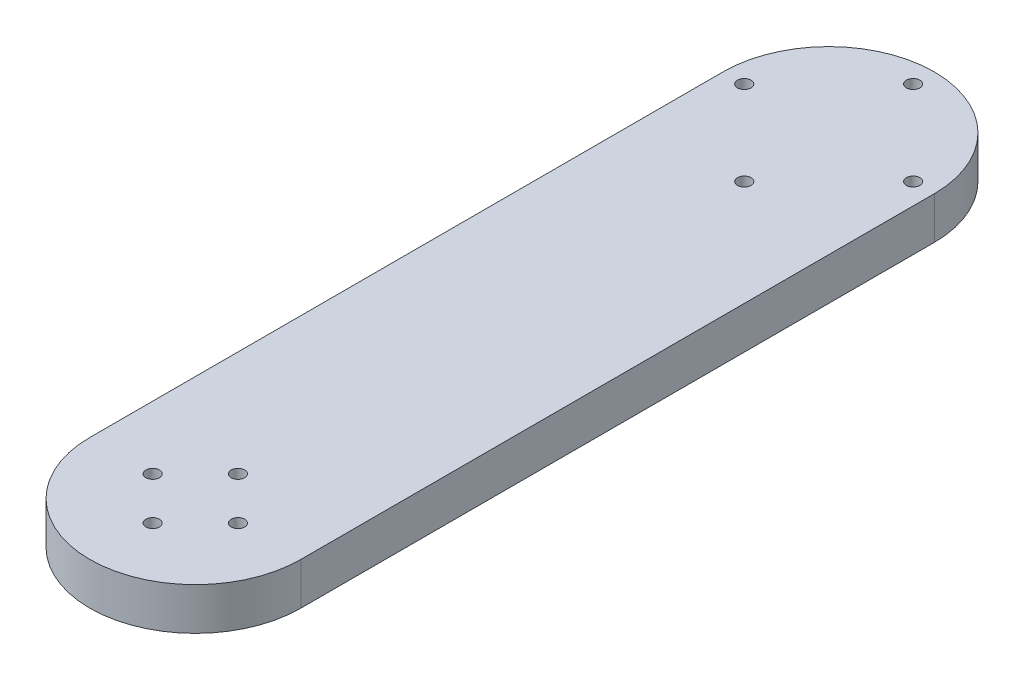
ISO-10303-21;
HEADER;
FILE_DESCRIPTION(('STEP AP214'),'2;1');
FILE_NAME('part.step','',(''),(''),'','','');
FILE_SCHEMA(('AUTOMOTIVE_DESIGN { 1 0 10303 214 1 1 1 1 }'));
ENDSEC;
DATA;
#1=APPLICATION_CONTEXT('core data for automotive mechanical design processes');
#2=APPLICATION_PROTOCOL_DEFINITION('international standard','automotive_design',2000,#1);
#3=PRODUCT_CONTEXT('',#1,'mechanical');
#4=PRODUCT('Part','Part','',(#3));
#5=PRODUCT_RELATED_PRODUCT_CATEGORY('part','',(#4));
#6=PRODUCT_DEFINITION_FORMATION('','',#4);
#7=PRODUCT_DEFINITION_CONTEXT('part definition',#1,'design');
#8=PRODUCT_DEFINITION('design','',#6,#7);
#9=PRODUCT_DEFINITION_SHAPE('','',#8);
#10=(LENGTH_UNIT() NAMED_UNIT(*) SI_UNIT(.MILLI.,.METRE.));
#11=(NAMED_UNIT(*) PLANE_ANGLE_UNIT() SI_UNIT($,.RADIAN.));
#12=(NAMED_UNIT(*) SI_UNIT($,.STERADIAN.) SOLID_ANGLE_UNIT());
#13=UNCERTAINTY_MEASURE_WITH_UNIT(LENGTH_MEASURE(1.E-05),#10,'distance_accuracy_value','');
#14=(GEOMETRIC_REPRESENTATION_CONTEXT(3) GLOBAL_UNCERTAINTY_ASSIGNED_CONTEXT((#13)) GLOBAL_UNIT_ASSIGNED_CONTEXT((#10,
#11,#12)) REPRESENTATION_CONTEXT('',''));
#15=CARTESIAN_POINT('',(0.,0.,0.));
#16=DIRECTION('',(0.,0.,1.));
#17=DIRECTION('',(1.,0.,0.));
#18=AXIS2_PLACEMENT_3D('',#15,#16,#17);
#19=CARTESIAN_POINT('',(0.,10.,0.));
#20=DIRECTION('',(0.,-1.,0.));
#21=DIRECTION('',(0.,0.,1.));
#22=AXIS2_PLACEMENT_3D('',#19,#20,#21);
#23=CYLINDRICAL_SURFACE('',#22,25.);
#24=CARTESIAN_POINT('',(0.,0.,0.));
#25=DIRECTION('',(0.,-1.,0.));
#26=DIRECTION('',(0.,0.,-1.));
#27=AXIS2_PLACEMENT_3D('',#24,#25,#26);
#28=CIRCLE('',#27,25.);
#29=CARTESIAN_POINT('',(25.,0.,0.));
#30=VERTEX_POINT('',#29);
#31=CARTESIAN_POINT('',(-25.,0.,0.));
#32=VERTEX_POINT('',#31);
#33=EDGE_CURVE('E107',#30,#32,#28,.T.);
#34=ORIENTED_EDGE('',*,*,#33,.F.);
#35=DIRECTION('',(0.,-1.,0.));
#36=VECTOR('',#35,1.);
#37=CARTESIAN_POINT('',(25.,10.,0.));
#38=LINE('',#37,#36);
#39=CARTESIAN_POINT('',(25.,10.,0.));
#40=VERTEX_POINT('',#39);
#41=EDGE_CURVE('E106',#40,#30,#38,.T.);
#42=ORIENTED_EDGE('',*,*,#41,.F.);
#43=CARTESIAN_POINT('',(0.,10.,0.));
#44=DIRECTION('',(0.,-1.,0.));
#45=DIRECTION('',(0.,0.,-1.));
#46=AXIS2_PLACEMENT_3D('',#43,#44,#45);
#47=CIRCLE('',#46,25.);
#48=CARTESIAN_POINT('',(-25.,10.,0.));
#49=VERTEX_POINT('',#48);
#50=EDGE_CURVE('E100',#40,#49,#47,.T.);
#51=ORIENTED_EDGE('',*,*,#50,.T.);
#52=DIRECTION('',(0.,-1.,0.));
#53=VECTOR('',#52,1.);
#54=CARTESIAN_POINT('',(-25.,10.,0.));
#55=LINE('',#54,#53);
#56=EDGE_CURVE('E11',#49,#32,#55,.T.);
#57=ORIENTED_EDGE('',*,*,#56,.T.);
#58=EDGE_LOOP('',(#34,#42,#51,#57));
#59=FACE_BOUND('',#58,.T.);
#60=ADVANCED_FACE('F43',(#59),#23,.T.);
#61=CARTESIAN_POINT('',(-25.,10.,0.));
#62=DIRECTION('',(1.,0.,0.));
#63=DIRECTION('',(0.,0.,1.));
#64=AXIS2_PLACEMENT_3D('',#61,#62,#63);
#65=PLANE('',#64);
#66=DIRECTION('',(0.,0.,-1.));
#67=VECTOR('',#66,1.);
#68=CARTESIAN_POINT('',(-25.,0.,0.));
#69=LINE('',#68,#67);
#70=CARTESIAN_POINT('',(-25.,0.,-150.));
#71=VERTEX_POINT('',#70);
#72=EDGE_CURVE('E109',#32,#71,#69,.T.);
#73=ORIENTED_EDGE('',*,*,#72,.F.);
#74=ORIENTED_EDGE('',*,*,#56,.F.);
#75=DIRECTION('',(0.,0.,-1.));
#76=VECTOR('',#75,1.);
#77=CARTESIAN_POINT('',(-25.,10.,0.));
#78=LINE('',#77,#76);
#79=CARTESIAN_POINT('',(-25.,10.,-150.));
#80=VERTEX_POINT('',#79);
#81=EDGE_CURVE('E84',#49,#80,#78,.T.);
#82=ORIENTED_EDGE('',*,*,#81,.T.);
#83=DIRECTION('',(0.,-1.,0.));
#84=VECTOR('',#83,1.);
#85=CARTESIAN_POINT('',(-25.,10.,-150.));
#86=LINE('',#85,#84);
#87=EDGE_CURVE('E51',#80,#71,#86,.T.);
#88=ORIENTED_EDGE('',*,*,#87,.T.);
#89=EDGE_LOOP('',(#73,#74,#82,#88));
#90=FACE_BOUND('',#89,.T.);
#91=ADVANCED_FACE('F98',(#90),#65,.F.);
#92=CARTESIAN_POINT('',(0.,10.,-150.));
#93=DIRECTION('',(0.,-1.,0.));
#94=DIRECTION('',(0.,0.,1.));
#95=AXIS2_PLACEMENT_3D('',#92,#93,#94);
#96=CYLINDRICAL_SURFACE('',#95,25.);
#97=CARTESIAN_POINT('',(0.,0.,-150.));
#98=DIRECTION('',(0.,-1.,0.));
#99=DIRECTION('',(0.,0.,-1.));
#100=AXIS2_PLACEMENT_3D('',#97,#98,#99);
#101=CIRCLE('',#100,25.);
#102=CARTESIAN_POINT('',(25.,0.,-150.));
#103=VERTEX_POINT('',#102);
#104=EDGE_CURVE('E94',#71,#103,#101,.T.);
#105=ORIENTED_EDGE('',*,*,#104,.F.);
#106=ORIENTED_EDGE('',*,*,#87,.F.);
#107=CARTESIAN_POINT('',(0.,10.,-150.));
#108=DIRECTION('',(0.,-1.,0.));
#109=DIRECTION('',(0.,0.,-1.));
#110=AXIS2_PLACEMENT_3D('',#107,#108,#109);
#111=CIRCLE('',#110,25.);
#112=CARTESIAN_POINT('',(25.,10.,-150.));
#113=VERTEX_POINT('',#112);
#114=EDGE_CURVE('E87',#80,#113,#111,.T.);
#115=ORIENTED_EDGE('',*,*,#114,.T.);
#116=DIRECTION('',(0.,-1.,0.));
#117=VECTOR('',#116,1.);
#118=CARTESIAN_POINT('',(25.,10.,-150.));
#119=LINE('',#118,#117);
#120=EDGE_CURVE('E97',#113,#103,#119,.T.);
#121=ORIENTED_EDGE('',*,*,#120,.T.);
#122=EDGE_LOOP('',(#105,#106,#115,#121));
#123=FACE_BOUND('',#122,.T.);
#124=ADVANCED_FACE('F93',(#123),#96,.T.);
#125=CARTESIAN_POINT('',(25.,10.,0.));
#126=DIRECTION('',(-1.,0.,0.));
#127=DIRECTION('',(0.,0.,-1.));
#128=AXIS2_PLACEMENT_3D('',#125,#126,#127);
#129=PLANE('',#128);
#130=DIRECTION('',(0.,0.,1.));
#131=VECTOR('',#130,1.);
#132=CARTESIAN_POINT('',(25.,0.,0.));
#133=LINE('',#132,#131);
#134=EDGE_CURVE('E73',#103,#30,#133,.T.);
#135=ORIENTED_EDGE('',*,*,#134,.F.);
#136=ORIENTED_EDGE('',*,*,#120,.F.);
#137=DIRECTION('',(0.,0.,1.));
#138=VECTOR('',#137,1.);
#139=CARTESIAN_POINT('',(25.,10.,0.));
#140=LINE('',#139,#138);
#141=EDGE_CURVE('E59',#113,#40,#140,.T.);
#142=ORIENTED_EDGE('',*,*,#141,.T.);
#143=ORIENTED_EDGE('',*,*,#41,.T.);
#144=EDGE_LOOP('',(#135,#136,#142,#143));
#145=FACE_BOUND('',#144,.T.);
#146=ADVANCED_FACE('F119',(#145),#129,.F.);
#147=CARTESIAN_POINT('',(0.,10.,0.));
#148=DIRECTION('',(0.,1.,0.));
#149=DIRECTION('',(0.,0.,-1.));
#150=AXIS2_PLACEMENT_3D('',#147,#148,#149);
#151=PLANE('',#150);
#152=CARTESIAN_POINT('',(0.,10.,-130.));
#153=DIRECTION('',(0.,1.,0.));
#154=DIRECTION('',(0.,0.,1.));
#155=AXIS2_PLACEMENT_3D('',#152,#153,#154);
#156=CIRCLE('',#155,1.59999999999999);
#157=CARTESIAN_POINT('',(0.,10.,-128.4));
#158=VERTEX_POINT('',#157);
#159=EDGE_CURVE('E247',#158,#158,#156,.T.);
#160=ORIENTED_EDGE('',*,*,#159,.F.);
#161=EDGE_LOOP('',(#160));
#162=FACE_BOUND('',#161,.T.);
#163=CARTESIAN_POINT('',(20.,10.,-150.));
#164=DIRECTION('',(0.,1.,0.));
#165=DIRECTION('',(0.,0.,1.));
#166=AXIS2_PLACEMENT_3D('',#163,#164,#165);
#167=CIRCLE('',#166,1.59999999999999);
#168=CARTESIAN_POINT('',(20.,10.,-148.4));
#169=VERTEX_POINT('',#168);
#170=EDGE_CURVE('E256',#169,#169,#167,.T.);
#171=ORIENTED_EDGE('',*,*,#170,.F.);
#172=EDGE_LOOP('',(#171));
#173=FACE_BOUND('',#172,.T.);
#174=CARTESIAN_POINT('',(0.,10.,-170.));
#175=DIRECTION('',(0.,1.,0.));
#176=DIRECTION('',(0.,0.,1.));
#177=AXIS2_PLACEMENT_3D('',#174,#175,#176);
#178=CIRCLE('',#177,1.59999999999999);
#179=CARTESIAN_POINT('',(0.,10.,-168.4));
#180=VERTEX_POINT('',#179);
#181=EDGE_CURVE('E264',#180,#180,#178,.T.);
#182=ORIENTED_EDGE('',*,*,#181,.F.);
#183=EDGE_LOOP('',(#182));
#184=FACE_BOUND('',#183,.T.);
#185=CARTESIAN_POINT('',(-20.,10.,-150.));
#186=DIRECTION('',(0.,1.,0.));
#187=DIRECTION('',(0.,0.,1.));
#188=AXIS2_PLACEMENT_3D('',#185,#186,#187);
#189=CIRCLE('',#188,1.59999999999999);
#190=CARTESIAN_POINT('',(-20.,10.,-148.4));
#191=VERTEX_POINT('',#190);
#192=EDGE_CURVE('E270',#191,#191,#189,.T.);
#193=ORIENTED_EDGE('',*,*,#192,.F.);
#194=EDGE_LOOP('',(#193));
#195=FACE_BOUND('',#194,.T.);
#196=CARTESIAN_POINT('',(10.0985931710275,10.,0.));
#197=DIRECTION('',(0.,1.,0.));
#198=DIRECTION('',(0.,0.,1.));
#199=AXIS2_PLACEMENT_3D('',#196,#197,#198);
#200=CIRCLE('',#199,1.6);
#201=CARTESIAN_POINT('',(10.0985931710275,10.,1.60000000000001));
#202=VERTEX_POINT('',#201);
#203=EDGE_CURVE('E110',#202,#202,#200,.T.);
#204=ORIENTED_EDGE('',*,*,#203,.F.);
#205=EDGE_LOOP('',(#204));
#206=FACE_BOUND('',#205,.T.);
#207=CARTESIAN_POINT('',(0.,10.,-10.0985931710274));
#208=DIRECTION('',(0.,1.,0.));
#209=DIRECTION('',(0.,0.,1.));
#210=AXIS2_PLACEMENT_3D('',#207,#208,#209);
#211=CIRCLE('',#210,1.6);
#212=CARTESIAN_POINT('',(0.,10.,-8.49859317102744));
#213=VERTEX_POINT('',#212);
#214=EDGE_CURVE('E281',#213,#213,#211,.T.);
#215=ORIENTED_EDGE('',*,*,#214,.F.);
#216=EDGE_LOOP('',(#215));
#217=FACE_BOUND('',#216,.T.);
#218=CARTESIAN_POINT('',(0.,10.,10.0985931710275));
#219=DIRECTION('',(0.,1.,0.));
#220=DIRECTION('',(0.,0.,1.));
#221=AXIS2_PLACEMENT_3D('',#218,#219,#220);
#222=CIRCLE('',#221,1.6);
#223=CARTESIAN_POINT('',(0.,10.,11.6985931710275));
#224=VERTEX_POINT('',#223);
#225=EDGE_CURVE('E287',#224,#224,#222,.T.);
#226=ORIENTED_EDGE('',*,*,#225,.F.);
#227=EDGE_LOOP('',(#226));
#228=FACE_BOUND('',#227,.T.);
#229=CARTESIAN_POINT('',(-10.0985931710274,10.,0.));
#230=DIRECTION('',(0.,1.,0.));
#231=DIRECTION('',(0.,0.,1.));
#232=AXIS2_PLACEMENT_3D('',#229,#230,#231);
#233=CIRCLE('',#232,1.6);
#234=CARTESIAN_POINT('',(-10.0985931710274,10.,1.60000000000001));
#235=VERTEX_POINT('',#234);
#236=EDGE_CURVE('E253',#235,#235,#233,.T.);
#237=ORIENTED_EDGE('',*,*,#236,.F.);
#238=EDGE_LOOP('',(#237));
#239=FACE_BOUND('',#238,.T.);
#240=ORIENTED_EDGE('',*,*,#50,.F.);
#241=ORIENTED_EDGE('',*,*,#141,.F.);
#242=ORIENTED_EDGE('',*,*,#114,.F.);
#243=ORIENTED_EDGE('',*,*,#81,.F.);
#244=EDGE_LOOP('',(#240,#241,#242,#243));
#245=FACE_BOUND('',#244,.T.);
#246=ADVANCED_FACE('F89',(#162,#173,#184,#195,#206,#217,#228,#239,#245),#151,.T.);
#247=CARTESIAN_POINT('',(0.,0.,0.));
#248=DIRECTION('',(0.,1.,0.));
#249=DIRECTION('',(0.,0.,-1.));
#250=AXIS2_PLACEMENT_3D('',#247,#248,#249);
#251=PLANE('',#250);
#252=CARTESIAN_POINT('',(0.,0.,-130.));
#253=DIRECTION('',(0.,1.,0.));
#254=DIRECTION('',(0.,0.,1.));
#255=AXIS2_PLACEMENT_3D('',#252,#253,#254);
#256=CIRCLE('',#255,1.59999999999999);
#257=CARTESIAN_POINT('',(0.,0.,-128.4));
#258=VERTEX_POINT('',#257);
#259=EDGE_CURVE('E250',#258,#258,#256,.T.);
#260=ORIENTED_EDGE('',*,*,#259,.T.);
#261=EDGE_LOOP('',(#260));
#262=FACE_BOUND('',#261,.T.);
#263=CARTESIAN_POINT('',(20.,0.,-150.));
#264=DIRECTION('',(0.,1.,0.));
#265=DIRECTION('',(0.,0.,1.));
#266=AXIS2_PLACEMENT_3D('',#263,#264,#265);
#267=CIRCLE('',#266,1.59999999999999);
#268=CARTESIAN_POINT('',(20.,0.,-148.4));
#269=VERTEX_POINT('',#268);
#270=EDGE_CURVE('E251',#269,#269,#267,.T.);
#271=ORIENTED_EDGE('',*,*,#270,.T.);
#272=EDGE_LOOP('',(#271));
#273=FACE_BOUND('',#272,.T.);
#274=CARTESIAN_POINT('',(0.,0.,-170.));
#275=DIRECTION('',(0.,1.,0.));
#276=DIRECTION('',(0.,0.,1.));
#277=AXIS2_PLACEMENT_3D('',#274,#275,#276);
#278=CIRCLE('',#277,1.59999999999999);
#279=CARTESIAN_POINT('',(0.,0.,-168.4));
#280=VERTEX_POINT('',#279);
#281=EDGE_CURVE('E261',#280,#280,#278,.T.);
#282=ORIENTED_EDGE('',*,*,#281,.T.);
#283=EDGE_LOOP('',(#282));
#284=FACE_BOUND('',#283,.T.);
#285=CARTESIAN_POINT('',(-20.,0.,-150.));
#286=DIRECTION('',(0.,1.,0.));
#287=DIRECTION('',(0.,0.,1.));
#288=AXIS2_PLACEMENT_3D('',#285,#286,#287);
#289=CIRCLE('',#288,1.59999999999999);
#290=CARTESIAN_POINT('',(-20.,0.,-148.4));
#291=VERTEX_POINT('',#290);
#292=EDGE_CURVE('E267',#291,#291,#289,.T.);
#293=ORIENTED_EDGE('',*,*,#292,.T.);
#294=EDGE_LOOP('',(#293));
#295=FACE_BOUND('',#294,.T.);
#296=CARTESIAN_POINT('',(10.0985931710275,0.,0.));
#297=DIRECTION('',(0.,1.,0.));
#298=DIRECTION('',(0.,0.,1.));
#299=AXIS2_PLACEMENT_3D('',#296,#297,#298);
#300=CIRCLE('',#299,1.6);
#301=CARTESIAN_POINT('',(10.0985931710275,0.,1.60000000000001));
#302=VERTEX_POINT('',#301);
#303=EDGE_CURVE('E275',#302,#302,#300,.T.);
#304=ORIENTED_EDGE('',*,*,#303,.T.);
#305=EDGE_LOOP('',(#304));
#306=FACE_BOUND('',#305,.T.);
#307=CARTESIAN_POINT('',(0.,0.,-10.0985931710274));
#308=DIRECTION('',(0.,1.,0.));
#309=DIRECTION('',(0.,0.,1.));
#310=AXIS2_PLACEMENT_3D('',#307,#308,#309);
#311=CIRCLE('',#310,1.6);
#312=CARTESIAN_POINT('',(0.,0.,-8.49859317102744));
#313=VERTEX_POINT('',#312);
#314=EDGE_CURVE('E278',#313,#313,#311,.T.);
#315=ORIENTED_EDGE('',*,*,#314,.T.);
#316=EDGE_LOOP('',(#315));
#317=FACE_BOUND('',#316,.T.);
#318=CARTESIAN_POINT('',(0.,0.,10.0985931710275));
#319=DIRECTION('',(0.,1.,0.));
#320=DIRECTION('',(0.,0.,1.));
#321=AXIS2_PLACEMENT_3D('',#318,#319,#320);
#322=CIRCLE('',#321,1.6);
#323=CARTESIAN_POINT('',(0.,0.,11.6985931710275));
#324=VERTEX_POINT('',#323);
#325=EDGE_CURVE('E284',#324,#324,#322,.T.);
#326=ORIENTED_EDGE('',*,*,#325,.T.);
#327=EDGE_LOOP('',(#326));
#328=FACE_BOUND('',#327,.T.);
#329=CARTESIAN_POINT('',(-10.0985931710274,0.,0.));
#330=DIRECTION('',(0.,1.,0.));
#331=DIRECTION('',(0.,0.,1.));
#332=AXIS2_PLACEMENT_3D('',#329,#330,#331);
#333=CIRCLE('',#332,1.6);
#334=CARTESIAN_POINT('',(-10.0985931710274,0.,1.60000000000001));
#335=VERTEX_POINT('',#334);
#336=EDGE_CURVE('E290',#335,#335,#333,.T.);
#337=ORIENTED_EDGE('',*,*,#336,.T.);
#338=EDGE_LOOP('',(#337));
#339=FACE_BOUND('',#338,.T.);
#340=ORIENTED_EDGE('',*,*,#33,.T.);
#341=ORIENTED_EDGE('',*,*,#72,.T.);
#342=ORIENTED_EDGE('',*,*,#104,.T.);
#343=ORIENTED_EDGE('',*,*,#134,.T.);
#344=EDGE_LOOP('',(#340,#341,#342,#343));
#345=FACE_BOUND('',#344,.T.);
#346=ADVANCED_FACE('F115',(#262,#273,#284,#295,#306,#317,#328,#339,#345),#251,.F.);
#347=CARTESIAN_POINT('',(-10.0985931710274,10.,0.));
#348=DIRECTION('',(0.,-1.,0.));
#349=DIRECTION('',(0.,0.,1.));
#350=AXIS2_PLACEMENT_3D('',#347,#348,#349);
#351=CYLINDRICAL_SURFACE('',#350,1.6);
#352=ORIENTED_EDGE('',*,*,#236,.T.);
#353=EDGE_LOOP('',(#352));
#354=FACE_BOUND('',#353,.T.);
#355=ORIENTED_EDGE('',*,*,#336,.F.);
#356=EDGE_LOOP('',(#355));
#357=FACE_BOUND('',#356,.T.);
#358=ADVANCED_FACE('F162',(#354,#357),#351,.F.);
#359=CARTESIAN_POINT('',(0.,10.,10.0985931710275));
#360=DIRECTION('',(0.,-1.,0.));
#361=DIRECTION('',(0.,0.,1.));
#362=AXIS2_PLACEMENT_3D('',#359,#360,#361);
#363=CYLINDRICAL_SURFACE('',#362,1.6);
#364=ORIENTED_EDGE('',*,*,#225,.T.);
#365=EDGE_LOOP('',(#364));
#366=FACE_BOUND('',#365,.T.);
#367=ORIENTED_EDGE('',*,*,#325,.F.);
#368=EDGE_LOOP('',(#367));
#369=FACE_BOUND('',#368,.T.);
#370=ADVANCED_FACE('F172',(#366,#369),#363,.F.);
#371=CARTESIAN_POINT('',(0.,10.,-10.0985931710274));
#372=DIRECTION('',(0.,-1.,0.));
#373=DIRECTION('',(0.,0.,1.));
#374=AXIS2_PLACEMENT_3D('',#371,#372,#373);
#375=CYLINDRICAL_SURFACE('',#374,1.6);
#376=ORIENTED_EDGE('',*,*,#214,.T.);
#377=EDGE_LOOP('',(#376));
#378=FACE_BOUND('',#377,.T.);
#379=ORIENTED_EDGE('',*,*,#314,.F.);
#380=EDGE_LOOP('',(#379));
#381=FACE_BOUND('',#380,.T.);
#382=ADVANCED_FACE('F182',(#378,#381),#375,.F.);
#383=CARTESIAN_POINT('',(10.0985931710275,10.,0.));
#384=DIRECTION('',(0.,-1.,0.));
#385=DIRECTION('',(0.,0.,1.));
#386=AXIS2_PLACEMENT_3D('',#383,#384,#385);
#387=CYLINDRICAL_SURFACE('',#386,1.6);
#388=ORIENTED_EDGE('',*,*,#203,.T.);
#389=EDGE_LOOP('',(#388));
#390=FACE_BOUND('',#389,.T.);
#391=ORIENTED_EDGE('',*,*,#303,.F.);
#392=EDGE_LOOP('',(#391));
#393=FACE_BOUND('',#392,.T.);
#394=ADVANCED_FACE('F193',(#390,#393),#387,.F.);
#395=CARTESIAN_POINT('',(-20.,10.,-150.));
#396=DIRECTION('',(0.,-1.,0.));
#397=DIRECTION('',(0.,0.,1.));
#398=AXIS2_PLACEMENT_3D('',#395,#396,#397);
#399=CYLINDRICAL_SURFACE('',#398,1.59999999999999);
#400=ORIENTED_EDGE('',*,*,#192,.T.);
#401=EDGE_LOOP('',(#400));
#402=FACE_BOUND('',#401,.T.);
#403=ORIENTED_EDGE('',*,*,#292,.F.);
#404=EDGE_LOOP('',(#403));
#405=FACE_BOUND('',#404,.T.);
#406=ADVANCED_FACE('F203',(#402,#405),#399,.F.);
#407=CARTESIAN_POINT('',(0.,10.,-170.));
#408=DIRECTION('',(0.,-1.,0.));
#409=DIRECTION('',(0.,0.,1.));
#410=AXIS2_PLACEMENT_3D('',#407,#408,#409);
#411=CYLINDRICAL_SURFACE('',#410,1.59999999999999);
#412=ORIENTED_EDGE('',*,*,#181,.T.);
#413=EDGE_LOOP('',(#412));
#414=FACE_BOUND('',#413,.T.);
#415=ORIENTED_EDGE('',*,*,#281,.F.);
#416=EDGE_LOOP('',(#415));
#417=FACE_BOUND('',#416,.T.);
#418=ADVANCED_FACE('F213',(#414,#417),#411,.F.);
#419=CARTESIAN_POINT('',(20.,10.,-150.));
#420=DIRECTION('',(0.,-1.,0.));
#421=DIRECTION('',(0.,0.,1.));
#422=AXIS2_PLACEMENT_3D('',#419,#420,#421);
#423=CYLINDRICAL_SURFACE('',#422,1.59999999999999);
#424=ORIENTED_EDGE('',*,*,#170,.T.);
#425=EDGE_LOOP('',(#424));
#426=FACE_BOUND('',#425,.T.);
#427=ORIENTED_EDGE('',*,*,#270,.F.);
#428=EDGE_LOOP('',(#427));
#429=FACE_BOUND('',#428,.T.);
#430=ADVANCED_FACE('F223',(#426,#429),#423,.F.);
#431=CARTESIAN_POINT('',(0.,10.,-130.));
#432=DIRECTION('',(0.,-1.,0.));
#433=DIRECTION('',(0.,0.,1.));
#434=AXIS2_PLACEMENT_3D('',#431,#432,#433);
#435=CYLINDRICAL_SURFACE('',#434,1.59999999999999);
#436=ORIENTED_EDGE('',*,*,#159,.T.);
#437=EDGE_LOOP('',(#436));
#438=FACE_BOUND('',#437,.T.);
#439=ORIENTED_EDGE('',*,*,#259,.F.);
#440=EDGE_LOOP('',(#439));
#441=FACE_BOUND('',#440,.T.);
#442=ADVANCED_FACE('F232',(#438,#441),#435,.F.);
#443=CLOSED_SHELL('',(#60,#91,#124,#146,#246,#346,#358,#370,#382,#394,#406,#418,#430,#442));
#444=MANIFOLD_SOLID_BREP('B2',#443);
#445=ADVANCED_BREP_SHAPE_REPRESENTATION('',(#18,#444),#14);
#446=SHAPE_DEFINITION_REPRESENTATION(#9,#445);
ENDSEC;
END-ISO-10303-21;
